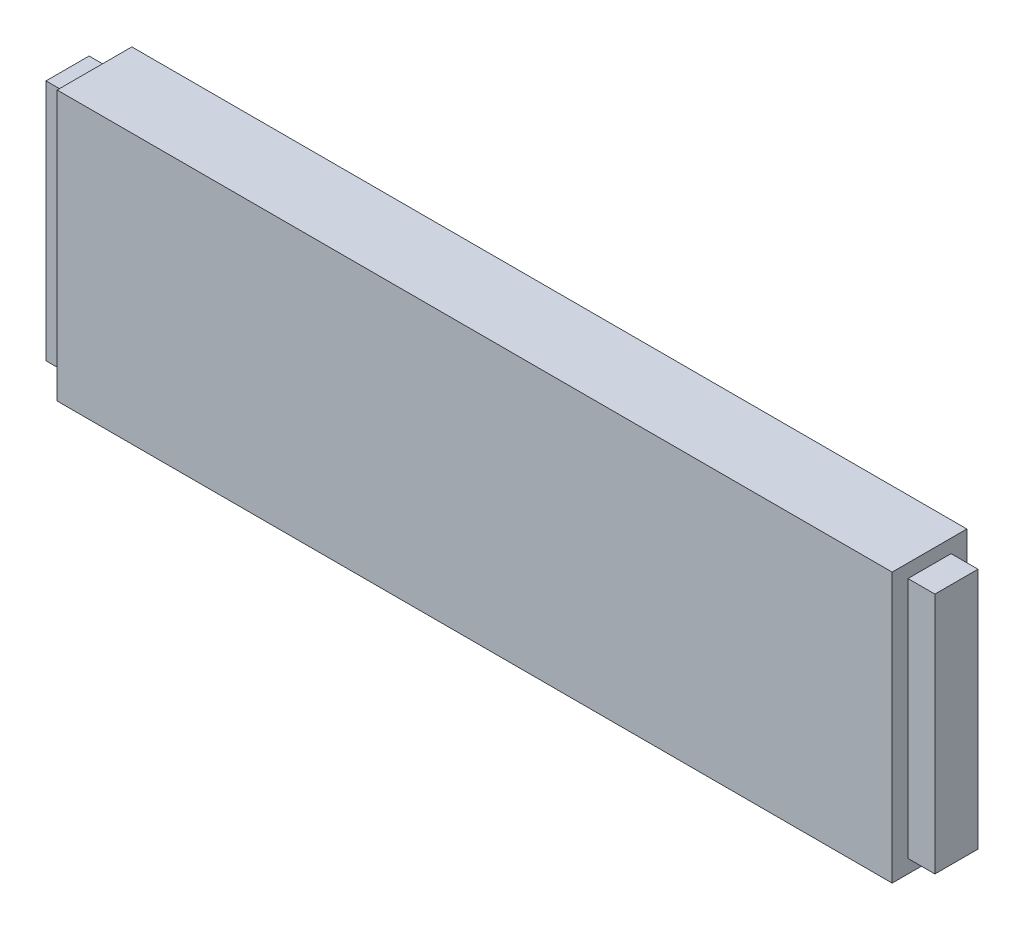
ISO-10303-21;
HEADER;
FILE_DESCRIPTION(('STEP AP214'),'2;1');
FILE_NAME('part.step','',(''),(''),'','','');
FILE_SCHEMA(('AUTOMOTIVE_DESIGN { 1 0 10303 214 1 1 1 1 }'));
ENDSEC;
DATA;
#1=APPLICATION_CONTEXT('core data for automotive mechanical design processes');
#2=APPLICATION_PROTOCOL_DEFINITION('international standard','automotive_design',2000,#1);
#3=PRODUCT_CONTEXT('',#1,'mechanical');
#4=PRODUCT('Part','Part','',(#3));
#5=PRODUCT_RELATED_PRODUCT_CATEGORY('part','',(#4));
#6=PRODUCT_DEFINITION_FORMATION('','',#4);
#7=PRODUCT_DEFINITION_CONTEXT('part definition',#1,'design');
#8=PRODUCT_DEFINITION('design','',#6,#7);
#9=PRODUCT_DEFINITION_SHAPE('','',#8);
#10=(LENGTH_UNIT() NAMED_UNIT(*) SI_UNIT(.MILLI.,.METRE.));
#11=(NAMED_UNIT(*) PLANE_ANGLE_UNIT() SI_UNIT($,.RADIAN.));
#12=(NAMED_UNIT(*) SI_UNIT($,.STERADIAN.) SOLID_ANGLE_UNIT());
#13=UNCERTAINTY_MEASURE_WITH_UNIT(LENGTH_MEASURE(1.E-05),#10,'distance_accuracy_value','');
#14=(GEOMETRIC_REPRESENTATION_CONTEXT(3) GLOBAL_UNCERTAINTY_ASSIGNED_CONTEXT((#13)) GLOBAL_UNIT_ASSIGNED_CONTEXT((#10,
#11,#12)) REPRESENTATION_CONTEXT('',''));
#15=CARTESIAN_POINT('',(0.,0.,0.));
#16=DIRECTION('',(0.,0.,1.));
#17=DIRECTION('',(1.,0.,0.));
#18=AXIS2_PLACEMENT_3D('',#15,#16,#17);
#19=CARTESIAN_POINT('',(-77.5,0.,0.));
#20=DIRECTION('',(1.,0.,0.));
#21=DIRECTION('',(0.,0.,-1.));
#22=AXIS2_PLACEMENT_3D('',#19,#20,#21);
#23=PLANE('',#22);
#24=DIRECTION('',(0.,-1.,0.));
#25=VECTOR('',#24,1.);
#26=CARTESIAN_POINT('',(-77.5,50.,-6.93251096398718));
#27=LINE('',#26,#25);
#28=CARTESIAN_POINT('',(-77.5,50.,-6.93251096398718));
#29=VERTEX_POINT('',#28);
#30=CARTESIAN_POINT('',(-77.5,0.,-6.93251096398718));
#31=VERTEX_POINT('',#30);
#32=EDGE_CURVE('E43',#29,#31,#27,.T.);
#33=ORIENTED_EDGE('',*,*,#32,.T.);
#34=DIRECTION('',(0.,0.,-1.));
#35=VECTOR('',#34,1.);
#36=CARTESIAN_POINT('',(-77.5,0.,0.));
#37=LINE('',#36,#35);
#38=CARTESIAN_POINT('',(-77.5,0.,6.93251096398718));
#39=VERTEX_POINT('',#38);
#40=EDGE_CURVE('E192',#39,#31,#37,.T.);
#41=ORIENTED_EDGE('',*,*,#40,.F.);
#42=DIRECTION('',(0.,-1.,0.));
#43=VECTOR('',#42,1.);
#44=CARTESIAN_POINT('',(-77.5,50.,6.93251096398718));
#45=LINE('',#44,#43);
#46=CARTESIAN_POINT('',(-77.5,50.,6.93251096398718));
#47=VERTEX_POINT('',#46);
#48=EDGE_CURVE('E188',#47,#39,#45,.T.);
#49=ORIENTED_EDGE('',*,*,#48,.F.);
#50=DIRECTION('',(0.,0.,-1.));
#51=VECTOR('',#50,1.);
#52=CARTESIAN_POINT('',(-77.5,50.,0.));
#53=LINE('',#52,#51);
#54=EDGE_CURVE('E191',#47,#29,#53,.T.);
#55=ORIENTED_EDGE('',*,*,#54,.T.);
#56=EDGE_LOOP('',(#33,#41,#49,#55));
#57=FACE_BOUND('',#56,.T.);
#58=DIRECTION('',(0.,1.,0.));
#59=VECTOR('',#58,1.);
#60=CARTESIAN_POINT('',(-77.5,47.5,3.99999999999999));
#61=LINE('',#60,#59);
#62=CARTESIAN_POINT('',(-77.5,2.5,3.99999999999999));
#63=VERTEX_POINT('',#62);
#64=CARTESIAN_POINT('',(-77.5,47.5,3.99999999999999));
#65=VERTEX_POINT('',#64);
#66=EDGE_CURVE('E56',#63,#65,#61,.T.);
#67=ORIENTED_EDGE('',*,*,#66,.F.);
#68=DIRECTION('',(0.,0.,1.));
#69=VECTOR('',#68,1.);
#70=CARTESIAN_POINT('',(-77.5,2.5,-4.));
#71=LINE('',#70,#69);
#72=CARTESIAN_POINT('',(-77.5,2.5,-4.));
#73=VERTEX_POINT('',#72);
#74=EDGE_CURVE('E60',#73,#63,#71,.T.);
#75=ORIENTED_EDGE('',*,*,#74,.F.);
#76=DIRECTION('',(0.,-1.,0.));
#77=VECTOR('',#76,1.);
#78=CARTESIAN_POINT('',(-77.5,47.5,-4.00000000000001));
#79=LINE('',#78,#77);
#80=CARTESIAN_POINT('',(-77.5,47.5,-4.00000000000001));
#81=VERTEX_POINT('',#80);
#82=EDGE_CURVE('E386',#81,#73,#79,.T.);
#83=ORIENTED_EDGE('',*,*,#82,.F.);
#84=DIRECTION('',(0.,0.,-1.));
#85=VECTOR('',#84,1.);
#86=CARTESIAN_POINT('',(-77.5,47.5,-4.00000000000001));
#87=LINE('',#86,#85);
#88=EDGE_CURVE('E392',#65,#81,#87,.T.);
#89=ORIENTED_EDGE('',*,*,#88,.F.);
#90=EDGE_LOOP('',(#67,#75,#83,#89));
#91=FACE_BOUND('',#90,.T.);
#92=ADVANCED_FACE('F39',(#57,#91),#23,.F.);
#93=CARTESIAN_POINT('',(77.5,0.,0.));
#94=DIRECTION('',(-1.,0.,0.));
#95=DIRECTION('',(0.,0.,1.));
#96=AXIS2_PLACEMENT_3D('',#93,#94,#95);
#97=PLANE('',#96);
#98=DIRECTION('',(0.,0.,1.));
#99=VECTOR('',#98,1.);
#100=CARTESIAN_POINT('',(77.5,50.,0.));
#101=LINE('',#100,#99);
#102=CARTESIAN_POINT('',(77.5,50.,-6.93251096398718));
#103=VERTEX_POINT('',#102);
#104=CARTESIAN_POINT('',(77.5,50.,6.93251096398718));
#105=VERTEX_POINT('',#104);
#106=EDGE_CURVE('E205',#103,#105,#101,.T.);
#107=ORIENTED_EDGE('',*,*,#106,.T.);
#108=DIRECTION('',(0.,1.,0.));
#109=VECTOR('',#108,1.);
#110=CARTESIAN_POINT('',(77.5,50.,6.93251096398718));
#111=LINE('',#110,#109);
#112=CARTESIAN_POINT('',(77.5,0.,6.93251096398718));
#113=VERTEX_POINT('',#112);
#114=EDGE_CURVE('E190',#113,#105,#111,.T.);
#115=ORIENTED_EDGE('',*,*,#114,.F.);
#116=DIRECTION('',(0.,0.,1.));
#117=VECTOR('',#116,1.);
#118=CARTESIAN_POINT('',(77.5,0.,0.));
#119=LINE('',#118,#117);
#120=CARTESIAN_POINT('',(77.5,0.,-6.93251096398718));
#121=VERTEX_POINT('',#120);
#122=EDGE_CURVE('E194',#121,#113,#119,.T.);
#123=ORIENTED_EDGE('',*,*,#122,.F.);
#124=DIRECTION('',(0.,-1.,0.));
#125=VECTOR('',#124,1.);
#126=CARTESIAN_POINT('',(77.5,50.,-6.93251096398718));
#127=LINE('',#126,#125);
#128=EDGE_CURVE('E201',#103,#121,#127,.T.);
#129=ORIENTED_EDGE('',*,*,#128,.F.);
#130=EDGE_LOOP('',(#107,#115,#123,#129));
#131=FACE_BOUND('',#130,.T.);
#132=DIRECTION('',(0.,1.,0.));
#133=VECTOR('',#132,1.);
#134=CARTESIAN_POINT('',(77.5,47.5,-4.));
#135=LINE('',#134,#133);
#136=CARTESIAN_POINT('',(77.5,2.50000000000001,-4.00000000000001));
#137=VERTEX_POINT('',#136);
#138=CARTESIAN_POINT('',(77.5,47.5,-4.));
#139=VERTEX_POINT('',#138);
#140=EDGE_CURVE('E150',#137,#139,#135,.T.);
#141=ORIENTED_EDGE('',*,*,#140,.F.);
#142=DIRECTION('',(0.,0.,-1.));
#143=VECTOR('',#142,1.);
#144=CARTESIAN_POINT('',(77.5,2.50000000000001,3.99999999999999));
#145=LINE('',#144,#143);
#146=CARTESIAN_POINT('',(77.5,2.50000000000001,3.99999999999999));
#147=VERTEX_POINT('',#146);
#148=EDGE_CURVE('E163',#147,#137,#145,.T.);
#149=ORIENTED_EDGE('',*,*,#148,.F.);
#150=DIRECTION('',(0.,-1.,0.));
#151=VECTOR('',#150,1.);
#152=CARTESIAN_POINT('',(77.5,47.5,4.));
#153=LINE('',#152,#151);
#154=CARTESIAN_POINT('',(77.5,47.5,4.));
#155=VERTEX_POINT('',#154);
#156=EDGE_CURVE('E172',#155,#147,#153,.T.);
#157=ORIENTED_EDGE('',*,*,#156,.F.);
#158=DIRECTION('',(0.,0.,1.));
#159=VECTOR('',#158,1.);
#160=CARTESIAN_POINT('',(77.5,47.5,4.));
#161=LINE('',#160,#159);
#162=EDGE_CURVE('E153',#139,#155,#161,.T.);
#163=ORIENTED_EDGE('',*,*,#162,.F.);
#164=EDGE_LOOP('',(#141,#149,#157,#163));
#165=FACE_BOUND('',#164,.T.);
#166=ADVANCED_FACE('F223',(#131,#165),#97,.F.);
#167=CARTESIAN_POINT('',(0.,50.,-6.93251096398718));
#168=DIRECTION('',(0.,0.,-1.));
#169=DIRECTION('',(-1.,0.,0.));
#170=AXIS2_PLACEMENT_3D('',#167,#168,#169);
#171=PLANE('',#170);
#172=DIRECTION('',(1.,0.,0.));
#173=VECTOR('',#172,1.);
#174=CARTESIAN_POINT('',(0.,0.,-6.93251096398718));
#175=LINE('',#174,#173);
#176=EDGE_CURVE('E48',#31,#121,#175,.T.);
#177=ORIENTED_EDGE('',*,*,#176,.F.);
#178=ORIENTED_EDGE('',*,*,#32,.F.);
#179=DIRECTION('',(1.,0.,0.));
#180=VECTOR('',#179,1.);
#181=CARTESIAN_POINT('',(0.,50.,-6.93251096398718));
#182=LINE('',#181,#180);
#183=EDGE_CURVE('E198',#29,#103,#182,.T.);
#184=ORIENTED_EDGE('',*,*,#183,.T.);
#185=ORIENTED_EDGE('',*,*,#128,.T.);
#186=EDGE_LOOP('',(#177,#178,#184,#185));
#187=FACE_BOUND('',#186,.T.);
#188=ADVANCED_FACE('F219',(#187),#171,.T.);
#189=CARTESIAN_POINT('',(0.,50.,6.93251096398718));
#190=DIRECTION('',(0.,0.,-1.));
#191=DIRECTION('',(-1.,0.,0.));
#192=AXIS2_PLACEMENT_3D('',#189,#190,#191);
#193=PLANE('',#192);
#194=DIRECTION('',(1.,0.,0.));
#195=VECTOR('',#194,1.);
#196=CARTESIAN_POINT('',(0.,50.,6.93251096398718));
#197=LINE('',#196,#195);
#198=EDGE_CURVE('E197',#47,#105,#197,.T.);
#199=ORIENTED_EDGE('',*,*,#198,.F.);
#200=ORIENTED_EDGE('',*,*,#48,.T.);
#201=DIRECTION('',(1.,0.,0.));
#202=VECTOR('',#201,1.);
#203=CARTESIAN_POINT('',(0.,0.,6.93251096398718));
#204=LINE('',#203,#202);
#205=EDGE_CURVE('E11',#39,#113,#204,.T.);
#206=ORIENTED_EDGE('',*,*,#205,.T.);
#207=ORIENTED_EDGE('',*,*,#114,.T.);
#208=EDGE_LOOP('',(#199,#200,#206,#207));
#209=FACE_BOUND('',#208,.T.);
#210=ADVANCED_FACE('F230',(#209),#193,.F.);
#211=CARTESIAN_POINT('',(0.,0.,0.));
#212=DIRECTION('',(0.,1.,0.));
#213=DIRECTION('',(0.,0.,1.));
#214=AXIS2_PLACEMENT_3D('',#211,#212,#213);
#215=PLANE('',#214);
#216=ORIENTED_EDGE('',*,*,#205,.F.);
#217=ORIENTED_EDGE('',*,*,#40,.T.);
#218=ORIENTED_EDGE('',*,*,#176,.T.);
#219=ORIENTED_EDGE('',*,*,#122,.T.);
#220=EDGE_LOOP('',(#216,#217,#218,#219));
#221=FACE_BOUND('',#220,.T.);
#222=ADVANCED_FACE('F228',(#221),#215,.F.);
#223=CARTESIAN_POINT('',(0.,50.,0.));
#224=DIRECTION('',(0.,1.,0.));
#225=DIRECTION('',(0.,0.,1.));
#226=AXIS2_PLACEMENT_3D('',#223,#224,#225);
#227=PLANE('',#226);
#228=ORIENTED_EDGE('',*,*,#54,.F.);
#229=ORIENTED_EDGE('',*,*,#198,.T.);
#230=ORIENTED_EDGE('',*,*,#106,.F.);
#231=ORIENTED_EDGE('',*,*,#183,.F.);
#232=EDGE_LOOP('',(#228,#229,#230,#231));
#233=FACE_BOUND('',#232,.T.);
#234=ADVANCED_FACE('F41',(#233),#227,.T.);
#235=CARTESIAN_POINT('',(82.5,47.5,-4.));
#236=DIRECTION('',(0.,0.,1.));
#237=DIRECTION('',(0.,-1.,0.));
#238=AXIS2_PLACEMENT_3D('',#235,#236,#237);
#239=PLANE('',#238);
#240=ORIENTED_EDGE('',*,*,#140,.T.);
#241=DIRECTION('',(-1.,0.,0.));
#242=VECTOR('',#241,1.);
#243=CARTESIAN_POINT('',(82.5,47.5,-4.));
#244=LINE('',#243,#242);
#245=CARTESIAN_POINT('',(82.5,47.5,-4.));
#246=VERTEX_POINT('',#245);
#247=EDGE_CURVE('E185',#246,#139,#244,.T.);
#248=ORIENTED_EDGE('',*,*,#247,.F.);
#249=DIRECTION('',(0.,1.,0.));
#250=VECTOR('',#249,1.);
#251=CARTESIAN_POINT('',(82.5,47.5,-4.));
#252=LINE('',#251,#250);
#253=CARTESIAN_POINT('',(82.5,2.50000000000001,-4.00000000000001));
#254=VERTEX_POINT('',#253);
#255=EDGE_CURVE('E159',#254,#246,#252,.T.);
#256=ORIENTED_EDGE('',*,*,#255,.F.);
#257=DIRECTION('',(-1.,0.,0.));
#258=VECTOR('',#257,1.);
#259=CARTESIAN_POINT('',(82.5,2.50000000000001,-4.00000000000001));
#260=LINE('',#259,#258);
#261=EDGE_CURVE('E168',#254,#137,#260,.T.);
#262=ORIENTED_EDGE('',*,*,#261,.T.);
#263=EDGE_LOOP('',(#240,#248,#256,#262));
#264=FACE_BOUND('',#263,.T.);
#265=ADVANCED_FACE('F240',(#264),#239,.F.);
#266=CARTESIAN_POINT('',(82.5,47.5,4.));
#267=DIRECTION('',(0.,-1.,0.));
#268=DIRECTION('',(0.,0.,-1.));
#269=AXIS2_PLACEMENT_3D('',#266,#267,#268);
#270=PLANE('',#269);
#271=ORIENTED_EDGE('',*,*,#162,.T.);
#272=DIRECTION('',(-1.,0.,0.));
#273=VECTOR('',#272,1.);
#274=CARTESIAN_POINT('',(82.5,47.5,4.));
#275=LINE('',#274,#273);
#276=CARTESIAN_POINT('',(82.5,47.5,4.));
#277=VERTEX_POINT('',#276);
#278=EDGE_CURVE('E182',#277,#155,#275,.T.);
#279=ORIENTED_EDGE('',*,*,#278,.F.);
#280=DIRECTION('',(0.,0.,1.));
#281=VECTOR('',#280,1.);
#282=CARTESIAN_POINT('',(82.5,47.5,4.));
#283=LINE('',#282,#281);
#284=EDGE_CURVE('E162',#246,#277,#283,.T.);
#285=ORIENTED_EDGE('',*,*,#284,.F.);
#286=ORIENTED_EDGE('',*,*,#247,.T.);
#287=EDGE_LOOP('',(#271,#279,#285,#286));
#288=FACE_BOUND('',#287,.T.);
#289=ADVANCED_FACE('F252',(#288),#270,.F.);
#290=CARTESIAN_POINT('',(82.5,47.5,4.));
#291=DIRECTION('',(0.,0.,-1.));
#292=DIRECTION('',(0.,1.,0.));
#293=AXIS2_PLACEMENT_3D('',#290,#291,#292);
#294=PLANE('',#293);
#295=ORIENTED_EDGE('',*,*,#156,.T.);
#296=DIRECTION('',(-1.,0.,0.));
#297=VECTOR('',#296,1.);
#298=CARTESIAN_POINT('',(82.5,2.50000000000001,3.99999999999999));
#299=LINE('',#298,#297);
#300=CARTESIAN_POINT('',(82.5,2.50000000000001,3.99999999999999));
#301=VERTEX_POINT('',#300);
#302=EDGE_CURVE('E179',#301,#147,#299,.T.);
#303=ORIENTED_EDGE('',*,*,#302,.F.);
#304=DIRECTION('',(0.,-1.,0.));
#305=VECTOR('',#304,1.);
#306=CARTESIAN_POINT('',(82.5,47.5,4.));
#307=LINE('',#306,#305);
#308=EDGE_CURVE('E165',#277,#301,#307,.T.);
#309=ORIENTED_EDGE('',*,*,#308,.F.);
#310=ORIENTED_EDGE('',*,*,#278,.T.);
#311=EDGE_LOOP('',(#295,#303,#309,#310));
#312=FACE_BOUND('',#311,.T.);
#313=ADVANCED_FACE('F256',(#312),#294,.F.);
#314=CARTESIAN_POINT('',(82.5,2.50000000000001,3.99999999999999));
#315=DIRECTION('',(0.,1.,0.));
#316=DIRECTION('',(0.,0.,1.));
#317=AXIS2_PLACEMENT_3D('',#314,#315,#316);
#318=PLANE('',#317);
#319=ORIENTED_EDGE('',*,*,#148,.T.);
#320=ORIENTED_EDGE('',*,*,#261,.F.);
#321=DIRECTION('',(0.,0.,-1.));
#322=VECTOR('',#321,1.);
#323=CARTESIAN_POINT('',(82.5,2.50000000000001,3.99999999999999));
#324=LINE('',#323,#322);
#325=EDGE_CURVE('E167',#301,#254,#324,.T.);
#326=ORIENTED_EDGE('',*,*,#325,.F.);
#327=ORIENTED_EDGE('',*,*,#302,.T.);
#328=EDGE_LOOP('',(#319,#320,#326,#327));
#329=FACE_BOUND('',#328,.T.);
#330=ADVANCED_FACE('F260',(#329),#318,.F.);
#331=CARTESIAN_POINT('',(82.5,0.,0.));
#332=DIRECTION('',(1.,0.,0.));
#333=DIRECTION('',(0.,0.,-1.));
#334=AXIS2_PLACEMENT_3D('',#331,#332,#333);
#335=PLANE('',#334);
#336=ORIENTED_EDGE('',*,*,#255,.T.);
#337=ORIENTED_EDGE('',*,*,#284,.T.);
#338=ORIENTED_EDGE('',*,*,#308,.T.);
#339=ORIENTED_EDGE('',*,*,#325,.T.);
#340=EDGE_LOOP('',(#336,#337,#338,#339));
#341=FACE_BOUND('',#340,.T.);
#342=ADVANCED_FACE('F264',(#341),#335,.T.);
#343=CARTESIAN_POINT('',(-82.5,47.5,3.99999999999999));
#344=DIRECTION('',(0.,0.,-1.));
#345=DIRECTION('',(0.,1.,0.));
#346=AXIS2_PLACEMENT_3D('',#343,#344,#345);
#347=PLANE('',#346);
#348=ORIENTED_EDGE('',*,*,#66,.T.);
#349=DIRECTION('',(1.,0.,0.));
#350=VECTOR('',#349,1.);
#351=CARTESIAN_POINT('',(-82.5,47.5,3.99999999999999));
#352=LINE('',#351,#350);
#353=CARTESIAN_POINT('',(-82.5,47.5,3.99999999999999));
#354=VERTEX_POINT('',#353);
#355=EDGE_CURVE('E133',#354,#65,#352,.T.);
#356=ORIENTED_EDGE('',*,*,#355,.F.);
#357=DIRECTION('',(0.,1.,0.));
#358=VECTOR('',#357,1.);
#359=CARTESIAN_POINT('',(-82.5,47.5,3.99999999999999));
#360=LINE('',#359,#358);
#361=CARTESIAN_POINT('',(-82.5,2.5,3.99999999999999));
#362=VERTEX_POINT('',#361);
#363=EDGE_CURVE('E139',#362,#354,#360,.T.);
#364=ORIENTED_EDGE('',*,*,#363,.F.);
#365=DIRECTION('',(1.,0.,0.));
#366=VECTOR('',#365,1.);
#367=CARTESIAN_POINT('',(-82.5,2.5,3.99999999999999));
#368=LINE('',#367,#366);
#369=EDGE_CURVE('E384',#362,#63,#368,.T.);
#370=ORIENTED_EDGE('',*,*,#369,.T.);
#371=EDGE_LOOP('',(#348,#356,#364,#370));
#372=FACE_BOUND('',#371,.T.);
#373=ADVANCED_FACE('F149',(#372),#347,.F.);
#374=CARTESIAN_POINT('',(-82.5,47.5,-4.00000000000001));
#375=DIRECTION('',(0.,-1.,0.));
#376=DIRECTION('',(0.,0.,-1.));
#377=AXIS2_PLACEMENT_3D('',#374,#375,#376);
#378=PLANE('',#377);
#379=ORIENTED_EDGE('',*,*,#88,.T.);
#380=DIRECTION('',(1.,0.,0.));
#381=VECTOR('',#380,1.);
#382=CARTESIAN_POINT('',(-82.5,47.5,-4.00000000000001));
#383=LINE('',#382,#381);
#384=CARTESIAN_POINT('',(-82.5,47.5,-4.00000000000001));
#385=VERTEX_POINT('',#384);
#386=EDGE_CURVE('E135',#385,#81,#383,.T.);
#387=ORIENTED_EDGE('',*,*,#386,.F.);
#388=DIRECTION('',(0.,0.,-1.));
#389=VECTOR('',#388,1.);
#390=CARTESIAN_POINT('',(-82.5,47.5,-4.00000000000001));
#391=LINE('',#390,#389);
#392=EDGE_CURVE('E128',#354,#385,#391,.T.);
#393=ORIENTED_EDGE('',*,*,#392,.F.);
#394=ORIENTED_EDGE('',*,*,#355,.T.);
#395=EDGE_LOOP('',(#379,#387,#393,#394));
#396=FACE_BOUND('',#395,.T.);
#397=ADVANCED_FACE('F131',(#396),#378,.F.);
#398=CARTESIAN_POINT('',(-82.5,47.5,-4.00000000000001));
#399=DIRECTION('',(0.,0.,1.));
#400=DIRECTION('',(0.,-1.,0.));
#401=AXIS2_PLACEMENT_3D('',#398,#399,#400);
#402=PLANE('',#401);
#403=ORIENTED_EDGE('',*,*,#82,.T.);
#404=DIRECTION('',(1.,0.,0.));
#405=VECTOR('',#404,1.);
#406=CARTESIAN_POINT('',(-82.5,2.5,-4.));
#407=LINE('',#406,#405);
#408=CARTESIAN_POINT('',(-82.5,2.5,-4.));
#409=VERTEX_POINT('',#408);
#410=EDGE_CURVE('E155',#409,#73,#407,.T.);
#411=ORIENTED_EDGE('',*,*,#410,.F.);
#412=DIRECTION('',(0.,-1.,0.));
#413=VECTOR('',#412,1.);
#414=CARTESIAN_POINT('',(-82.5,47.5,-4.00000000000001));
#415=LINE('',#414,#413);
#416=EDGE_CURVE('E138',#385,#409,#415,.T.);
#417=ORIENTED_EDGE('',*,*,#416,.F.);
#418=ORIENTED_EDGE('',*,*,#386,.T.);
#419=EDGE_LOOP('',(#403,#411,#417,#418));
#420=FACE_BOUND('',#419,.T.);
#421=ADVANCED_FACE('F273',(#420),#402,.F.);
#422=CARTESIAN_POINT('',(-82.5,2.5,-4.));
#423=DIRECTION('',(0.,1.,0.));
#424=DIRECTION('',(0.,0.,1.));
#425=AXIS2_PLACEMENT_3D('',#422,#423,#424);
#426=PLANE('',#425);
#427=ORIENTED_EDGE('',*,*,#74,.T.);
#428=ORIENTED_EDGE('',*,*,#369,.F.);
#429=DIRECTION('',(0.,0.,1.));
#430=VECTOR('',#429,1.);
#431=CARTESIAN_POINT('',(-82.5,2.5,-4.));
#432=LINE('',#431,#430);
#433=EDGE_CURVE('E144',#409,#362,#432,.T.);
#434=ORIENTED_EDGE('',*,*,#433,.F.);
#435=ORIENTED_EDGE('',*,*,#410,.T.);
#436=EDGE_LOOP('',(#427,#428,#434,#435));
#437=FACE_BOUND('',#436,.T.);
#438=ADVANCED_FACE('F276',(#437),#426,.F.);
#439=CARTESIAN_POINT('',(-82.5,0.,0.));
#440=DIRECTION('',(-1.,0.,0.));
#441=DIRECTION('',(0.,0.,1.));
#442=AXIS2_PLACEMENT_3D('',#439,#440,#441);
#443=PLANE('',#442);
#444=ORIENTED_EDGE('',*,*,#363,.T.);
#445=ORIENTED_EDGE('',*,*,#392,.T.);
#446=ORIENTED_EDGE('',*,*,#416,.T.);
#447=ORIENTED_EDGE('',*,*,#433,.T.);
#448=EDGE_LOOP('',(#444,#445,#446,#447));
#449=FACE_BOUND('',#448,.T.);
#450=ADVANCED_FACE('F142',(#449),#443,.T.);
#451=CLOSED_SHELL('',(#92,#166,#188,#210,#222,#234,#265,#289,#313,#330,#342,#373,#397,#421,#438,#450));
#452=MANIFOLD_SOLID_BREP('B2',#451);
#453=ADVANCED_BREP_SHAPE_REPRESENTATION('',(#18,#452),#14);
#454=SHAPE_DEFINITION_REPRESENTATION(#9,#453);
ENDSEC;
END-ISO-10303-21;
